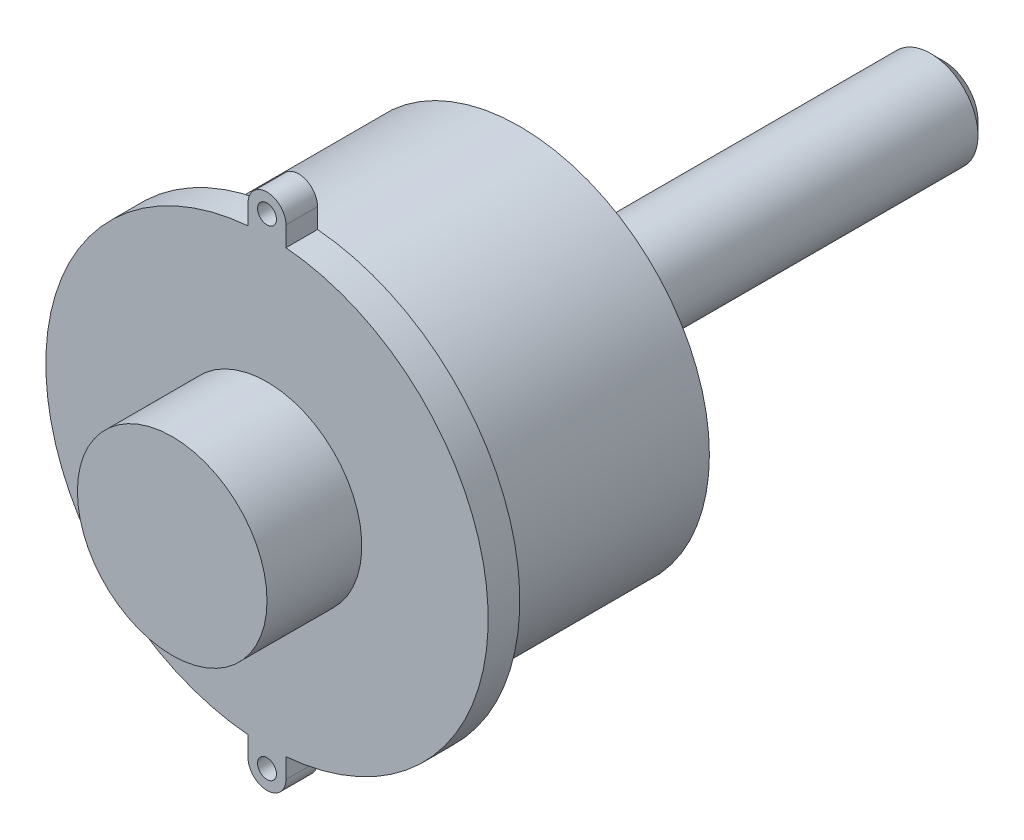
ISO-10303-21;
HEADER;
FILE_DESCRIPTION(('STEP AP214'),'2;1');
FILE_NAME('part.step','',(''),(''),'','','');
FILE_SCHEMA(('AUTOMOTIVE_DESIGN { 1 0 10303 214 1 1 1 1 }'));
ENDSEC;
DATA;
#1=APPLICATION_CONTEXT('core data for automotive mechanical design processes');
#2=APPLICATION_PROTOCOL_DEFINITION('international standard','automotive_design',2000,#1);
#3=PRODUCT_CONTEXT('',#1,'mechanical');
#4=PRODUCT('Part','Part','',(#3));
#5=PRODUCT_RELATED_PRODUCT_CATEGORY('part','',(#4));
#6=PRODUCT_DEFINITION_FORMATION('','',#4);
#7=PRODUCT_DEFINITION_CONTEXT('part definition',#1,'design');
#8=PRODUCT_DEFINITION('design','',#6,#7);
#9=PRODUCT_DEFINITION_SHAPE('','',#8);
#10=(LENGTH_UNIT() NAMED_UNIT(*) SI_UNIT(.MILLI.,.METRE.));
#11=(NAMED_UNIT(*) PLANE_ANGLE_UNIT() SI_UNIT($,.RADIAN.));
#12=(NAMED_UNIT(*) SI_UNIT($,.STERADIAN.) SOLID_ANGLE_UNIT());
#13=UNCERTAINTY_MEASURE_WITH_UNIT(LENGTH_MEASURE(1.E-05),#10,'distance_accuracy_value','');
#14=(GEOMETRIC_REPRESENTATION_CONTEXT(3) GLOBAL_UNCERTAINTY_ASSIGNED_CONTEXT((#13)) GLOBAL_UNIT_ASSIGNED_CONTEXT((#10,
#11,#12)) REPRESENTATION_CONTEXT('',''));
#15=CARTESIAN_POINT('',(0.,0.,0.));
#16=DIRECTION('',(0.,0.,1.));
#17=DIRECTION('',(1.,0.,0.));
#18=AXIS2_PLACEMENT_3D('',#15,#16,#17);
#19=CARTESIAN_POINT('',(0.,0.,-40.));
#20=DIRECTION('',(0.,0.,-1.));
#21=DIRECTION('',(-1.,0.,0.));
#22=AXIS2_PLACEMENT_3D('',#19,#20,#21);
#23=PLANE('',#22);
#24=CARTESIAN_POINT('',(0.,0.,-40.));
#25=DIRECTION('',(0.,0.,-1.));
#26=DIRECTION('',(-1.,0.,0.));
#27=AXIS2_PLACEMENT_3D('',#24,#25,#26);
#28=CIRCLE('',#27,30.);
#29=CARTESIAN_POINT('',(-30.,0.,-40.));
#30=VERTEX_POINT('',#29);
#31=EDGE_CURVE('E229',#30,#30,#28,.T.);
#32=ORIENTED_EDGE('',*,*,#31,.T.);
#33=EDGE_LOOP('',(#32));
#34=FACE_BOUND('',#33,.T.);
#35=CARTESIAN_POINT('',(0.,0.,-40.));
#36=DIRECTION('',(0.,0.,-1.));
#37=DIRECTION('',(-1.,0.,0.));
#38=AXIS2_PLACEMENT_3D('',#35,#36,#37);
#39=CIRCLE('',#38,10.);
#40=CARTESIAN_POINT('',(4.13231581223888,9.10625971669601,-40.));
#41=VERTEX_POINT('',#40);
#42=EDGE_CURVE('E220',#41,#41,#39,.T.);
#43=ORIENTED_EDGE('',*,*,#42,.F.);
#44=EDGE_LOOP('',(#43));
#45=FACE_BOUND('',#44,.T.);
#46=ADVANCED_FACE('F42',(#34,#45),#23,.T.);
#47=CARTESIAN_POINT('',(0.,38.,-5.));
#48=DIRECTION('',(0.,0.,1.));
#49=DIRECTION('',(1.,0.,0.));
#50=AXIS2_PLACEMENT_3D('',#47,#48,#49);
#51=CYLINDRICAL_SURFACE('',#50,3.00000000000001);
#52=CARTESIAN_POINT('',(0.,38.,0.));
#53=DIRECTION('',(0.,0.,1.));
#54=DIRECTION('',(-1.,0.,0.));
#55=AXIS2_PLACEMENT_3D('',#52,#53,#54);
#56=CIRCLE('',#55,3.00000000000001);
#57=CARTESIAN_POINT('',(3.00000000000002,38.,0.));
#58=VERTEX_POINT('',#57);
#59=CARTESIAN_POINT('',(-3.,38.,0.));
#60=VERTEX_POINT('',#59);
#61=EDGE_CURVE('E143',#58,#60,#56,.T.);
#62=ORIENTED_EDGE('',*,*,#61,.F.);
#63=DIRECTION('',(0.,0.,1.));
#64=VECTOR('',#63,1.);
#65=CARTESIAN_POINT('',(3.00000000000002,38.,-5.));
#66=LINE('',#65,#64);
#67=CARTESIAN_POINT('',(3.00000000000002,38.,-5.));
#68=VERTEX_POINT('',#67);
#69=EDGE_CURVE('E60',#68,#58,#66,.T.);
#70=ORIENTED_EDGE('',*,*,#69,.F.);
#71=CARTESIAN_POINT('',(0.,38.,-5.));
#72=DIRECTION('',(0.,0.,1.));
#73=DIRECTION('',(-1.,0.,0.));
#74=AXIS2_PLACEMENT_3D('',#71,#72,#73);
#75=CIRCLE('',#74,3.00000000000001);
#76=CARTESIAN_POINT('',(-3.,38.,-5.));
#77=VERTEX_POINT('',#76);
#78=EDGE_CURVE('E165',#68,#77,#75,.T.);
#79=ORIENTED_EDGE('',*,*,#78,.T.);
#80=DIRECTION('',(0.,0.,1.));
#81=VECTOR('',#80,1.);
#82=CARTESIAN_POINT('',(-3.,38.,-5.));
#83=LINE('',#82,#81);
#84=EDGE_CURVE('E101',#77,#60,#83,.T.);
#85=ORIENTED_EDGE('',*,*,#84,.T.);
#86=EDGE_LOOP('',(#62,#70,#79,#85));
#87=FACE_BOUND('',#86,.T.);
#88=ADVANCED_FACE('F265',(#87),#51,.T.);
#89=CARTESIAN_POINT('',(3.00000000000002,38.,-5.));
#90=DIRECTION('',(1.,0.,0.));
#91=DIRECTION('',(0.,1.,0.));
#92=AXIS2_PLACEMENT_3D('',#89,#90,#91);
#93=PLANE('',#92);
#94=DIRECTION('',(0.,1.,0.));
#95=VECTOR('',#94,1.);
#96=CARTESIAN_POINT('',(3.00000000000002,38.,0.));
#97=LINE('',#96,#95);
#98=CARTESIAN_POINT('',(3.00000000000003,34.8711915483254,0.));
#99=VERTEX_POINT('',#98);
#100=EDGE_CURVE('E162',#99,#58,#97,.T.);
#101=ORIENTED_EDGE('',*,*,#100,.F.);
#102=DIRECTION('',(0.,0.,1.));
#103=VECTOR('',#102,1.);
#104=CARTESIAN_POINT('',(3.00000000000003,34.8711915483254,-5.));
#105=LINE('',#104,#103);
#106=CARTESIAN_POINT('',(3.00000000000003,34.8711915483254,-5.));
#107=VERTEX_POINT('',#106);
#108=EDGE_CURVE('E89',#107,#99,#105,.T.);
#109=ORIENTED_EDGE('',*,*,#108,.F.);
#110=DIRECTION('',(0.,1.,0.));
#111=VECTOR('',#110,1.);
#112=CARTESIAN_POINT('',(3.00000000000002,38.,-5.));
#113=LINE('',#112,#111);
#114=EDGE_CURVE('E133',#107,#68,#113,.T.);
#115=ORIENTED_EDGE('',*,*,#114,.T.);
#116=ORIENTED_EDGE('',*,*,#69,.T.);
#117=EDGE_LOOP('',(#101,#109,#115,#116));
#118=FACE_BOUND('',#117,.T.);
#119=ADVANCED_FACE('F268',(#118),#93,.T.);
#120=CARTESIAN_POINT('',(0.,0.,-5.));
#121=DIRECTION('',(0.,0.,1.));
#122=DIRECTION('',(1.,0.,0.));
#123=AXIS2_PLACEMENT_3D('',#120,#121,#122);
#124=CYLINDRICAL_SURFACE('',#123,35.);
#125=CARTESIAN_POINT('',(0.,0.,0.));
#126=DIRECTION('',(0.,0.,1.));
#127=DIRECTION('',(1.,0.,0.));
#128=AXIS2_PLACEMENT_3D('',#125,#126,#127);
#129=CIRCLE('',#128,35.);
#130=CARTESIAN_POINT('',(3.00000000000002,-34.8711915483254,0.));
#131=VERTEX_POINT('',#130);
#132=EDGE_CURVE('E120',#131,#99,#129,.T.);
#133=ORIENTED_EDGE('',*,*,#132,.F.);
#134=DIRECTION('',(0.,0.,1.));
#135=VECTOR('',#134,1.);
#136=CARTESIAN_POINT('',(3.00000000000002,-34.8711915483254,-5.));
#137=LINE('',#136,#135);
#138=CARTESIAN_POINT('',(3.00000000000002,-34.8711915483254,-5.));
#139=VERTEX_POINT('',#138);
#140=EDGE_CURVE('E115',#139,#131,#137,.T.);
#141=ORIENTED_EDGE('',*,*,#140,.F.);
#142=CARTESIAN_POINT('',(0.,0.,-5.));
#143=DIRECTION('',(0.,0.,1.));
#144=DIRECTION('',(1.,0.,0.));
#145=AXIS2_PLACEMENT_3D('',#142,#143,#144);
#146=CIRCLE('',#145,35.);
#147=EDGE_CURVE('E118',#139,#107,#146,.T.);
#148=ORIENTED_EDGE('',*,*,#147,.T.);
#149=ORIENTED_EDGE('',*,*,#108,.T.);
#150=EDGE_LOOP('',(#133,#141,#148,#149));
#151=FACE_BOUND('',#150,.T.);
#152=ADVANCED_FACE('F117',(#151),#124,.T.);
#153=CARTESIAN_POINT('',(3.00000000000002,-38.,-5.));
#154=DIRECTION('',(1.,0.,0.));
#155=DIRECTION('',(0.,1.,0.));
#156=AXIS2_PLACEMENT_3D('',#153,#154,#155);
#157=PLANE('',#156);
#158=DIRECTION('',(0.,1.,0.));
#159=VECTOR('',#158,1.);
#160=CARTESIAN_POINT('',(3.00000000000002,-38.,0.));
#161=LINE('',#160,#159);
#162=CARTESIAN_POINT('',(3.00000000000002,-38.,0.));
#163=VERTEX_POINT('',#162);
#164=EDGE_CURVE('E159',#163,#131,#161,.T.);
#165=ORIENTED_EDGE('',*,*,#164,.F.);
#166=DIRECTION('',(0.,0.,1.));
#167=VECTOR('',#166,1.);
#168=CARTESIAN_POINT('',(3.00000000000002,-38.,-5.));
#169=LINE('',#168,#167);
#170=CARTESIAN_POINT('',(3.00000000000002,-38.,-5.));
#171=VERTEX_POINT('',#170);
#172=EDGE_CURVE('E125',#171,#163,#169,.T.);
#173=ORIENTED_EDGE('',*,*,#172,.F.);
#174=DIRECTION('',(0.,1.,0.));
#175=VECTOR('',#174,1.);
#176=CARTESIAN_POINT('',(3.00000000000002,-38.,-5.));
#177=LINE('',#176,#175);
#178=EDGE_CURVE('E131',#171,#139,#177,.T.);
#179=ORIENTED_EDGE('',*,*,#178,.T.);
#180=ORIENTED_EDGE('',*,*,#140,.T.);
#181=EDGE_LOOP('',(#165,#173,#179,#180));
#182=FACE_BOUND('',#181,.T.);
#183=ADVANCED_FACE('F135',(#182),#157,.T.);
#184=CARTESIAN_POINT('',(0.,-38.,-5.));
#185=DIRECTION('',(0.,0.,1.));
#186=DIRECTION('',(1.,0.,0.));
#187=AXIS2_PLACEMENT_3D('',#184,#185,#186);
#188=CYLINDRICAL_SURFACE('',#187,3.00000000000001);
#189=CARTESIAN_POINT('',(0.,-38.,0.));
#190=DIRECTION('',(0.,0.,1.));
#191=DIRECTION('',(1.,0.,0.));
#192=AXIS2_PLACEMENT_3D('',#189,#190,#191);
#193=CIRCLE('',#192,3.00000000000001);
#194=CARTESIAN_POINT('',(-3.,-38.,0.));
#195=VERTEX_POINT('',#194);
#196=EDGE_CURVE('E156',#195,#163,#193,.T.);
#197=ORIENTED_EDGE('',*,*,#196,.F.);
#198=DIRECTION('',(0.,0.,1.));
#199=VECTOR('',#198,1.);
#200=CARTESIAN_POINT('',(-3.,-38.,-5.));
#201=LINE('',#200,#199);
#202=CARTESIAN_POINT('',(-3.,-38.,-5.));
#203=VERTEX_POINT('',#202);
#204=EDGE_CURVE('E170',#203,#195,#201,.T.);
#205=ORIENTED_EDGE('',*,*,#204,.F.);
#206=CARTESIAN_POINT('',(0.,-38.,-5.));
#207=DIRECTION('',(0.,0.,1.));
#208=DIRECTION('',(1.,0.,0.));
#209=AXIS2_PLACEMENT_3D('',#206,#207,#208);
#210=CIRCLE('',#209,3.00000000000001);
#211=EDGE_CURVE('E136',#203,#171,#210,.T.);
#212=ORIENTED_EDGE('',*,*,#211,.T.);
#213=ORIENTED_EDGE('',*,*,#172,.T.);
#214=EDGE_LOOP('',(#197,#205,#212,#213));
#215=FACE_BOUND('',#214,.T.);
#216=ADVANCED_FACE('F412',(#215),#188,.T.);
#217=CARTESIAN_POINT('',(-3.,-38.,-5.));
#218=DIRECTION('',(-1.,0.,0.));
#219=DIRECTION('',(0.,0.,1.));
#220=AXIS2_PLACEMENT_3D('',#217,#218,#219);
#221=PLANE('',#220);
#222=DIRECTION('',(0.,-1.,0.));
#223=VECTOR('',#222,1.);
#224=CARTESIAN_POINT('',(-3.,-38.,0.));
#225=LINE('',#224,#223);
#226=CARTESIAN_POINT('',(-3.,-34.8711915483254,0.));
#227=VERTEX_POINT('',#226);
#228=EDGE_CURVE('E153',#227,#195,#225,.T.);
#229=ORIENTED_EDGE('',*,*,#228,.F.);
#230=DIRECTION('',(0.,0.,1.));
#231=VECTOR('',#230,1.);
#232=CARTESIAN_POINT('',(-3.,-34.8711915483254,-5.));
#233=LINE('',#232,#231);
#234=CARTESIAN_POINT('',(-3.,-34.8711915483254,-5.));
#235=VERTEX_POINT('',#234);
#236=EDGE_CURVE('E172',#235,#227,#233,.T.);
#237=ORIENTED_EDGE('',*,*,#236,.F.);
#238=DIRECTION('',(0.,-1.,0.));
#239=VECTOR('',#238,1.);
#240=CARTESIAN_POINT('',(-3.,-38.,-5.));
#241=LINE('',#240,#239);
#242=EDGE_CURVE('E138',#235,#203,#241,.T.);
#243=ORIENTED_EDGE('',*,*,#242,.T.);
#244=ORIENTED_EDGE('',*,*,#204,.T.);
#245=EDGE_LOOP('',(#229,#237,#243,#244));
#246=FACE_BOUND('',#245,.T.);
#247=ADVANCED_FACE('F258',(#246),#221,.T.);
#248=CARTESIAN_POINT('',(0.,0.,-5.));
#249=DIRECTION('',(0.,0.,1.));
#250=DIRECTION('',(1.,0.,0.));
#251=AXIS2_PLACEMENT_3D('',#248,#249,#250);
#252=CYLINDRICAL_SURFACE('',#251,35.);
#253=CARTESIAN_POINT('',(0.,0.,0.));
#254=DIRECTION('',(0.,0.,1.));
#255=DIRECTION('',(1.,0.,0.));
#256=AXIS2_PLACEMENT_3D('',#253,#254,#255);
#257=CIRCLE('',#256,35.);
#258=CARTESIAN_POINT('',(-3.,34.8711915483254,0.));
#259=VERTEX_POINT('',#258);
#260=EDGE_CURVE('E150',#259,#227,#257,.T.);
#261=ORIENTED_EDGE('',*,*,#260,.F.);
#262=DIRECTION('',(0.,0.,1.));
#263=VECTOR('',#262,1.);
#264=CARTESIAN_POINT('',(-3.,34.8711915483254,-5.));
#265=LINE('',#264,#263);
#266=CARTESIAN_POINT('',(-3.,34.8711915483254,-5.));
#267=VERTEX_POINT('',#266);
#268=EDGE_CURVE('E174',#267,#259,#265,.T.);
#269=ORIENTED_EDGE('',*,*,#268,.F.);
#270=CARTESIAN_POINT('',(0.,0.,-5.));
#271=DIRECTION('',(0.,0.,1.));
#272=DIRECTION('',(1.,0.,0.));
#273=AXIS2_PLACEMENT_3D('',#270,#271,#272);
#274=CIRCLE('',#273,35.);
#275=EDGE_CURVE('E252',#267,#235,#274,.T.);
#276=ORIENTED_EDGE('',*,*,#275,.T.);
#277=ORIENTED_EDGE('',*,*,#236,.T.);
#278=EDGE_LOOP('',(#261,#269,#276,#277));
#279=FACE_BOUND('',#278,.T.);
#280=ADVANCED_FACE('F263',(#279),#252,.T.);
#281=CARTESIAN_POINT('',(-3.,38.,-5.));
#282=DIRECTION('',(-1.,0.,0.));
#283=DIRECTION('',(0.,0.,1.));
#284=AXIS2_PLACEMENT_3D('',#281,#282,#283);
#285=PLANE('',#284);
#286=DIRECTION('',(0.,-1.,0.));
#287=VECTOR('',#286,1.);
#288=CARTESIAN_POINT('',(-3.,38.,0.));
#289=LINE('',#288,#287);
#290=EDGE_CURVE('E146',#60,#259,#289,.T.);
#291=ORIENTED_EDGE('',*,*,#290,.F.);
#292=ORIENTED_EDGE('',*,*,#84,.F.);
#293=DIRECTION('',(0.,-1.,0.));
#294=VECTOR('',#293,1.);
#295=CARTESIAN_POINT('',(-3.,38.,-5.));
#296=LINE('',#295,#294);
#297=EDGE_CURVE('E250',#77,#267,#296,.T.);
#298=ORIENTED_EDGE('',*,*,#297,.T.);
#299=ORIENTED_EDGE('',*,*,#268,.T.);
#300=EDGE_LOOP('',(#291,#292,#298,#299));
#301=FACE_BOUND('',#300,.T.);
#302=ADVANCED_FACE('F264',(#301),#285,.T.);
#303=CARTESIAN_POINT('',(0.,38.,-5.));
#304=DIRECTION('',(0.,0.,-1.));
#305=DIRECTION('',(-1.,0.,0.));
#306=AXIS2_PLACEMENT_3D('',#303,#304,#305);
#307=PLANE('',#306);
#308=CARTESIAN_POINT('',(0.,0.,-5.));
#309=DIRECTION('',(0.,0.,-1.));
#310=DIRECTION('',(-1.,0.,0.));
#311=AXIS2_PLACEMENT_3D('',#308,#309,#310);
#312=CIRCLE('',#311,30.);
#313=CARTESIAN_POINT('',(-30.,0.,-5.));
#314=VERTEX_POINT('',#313);
#315=EDGE_CURVE('E233',#314,#314,#312,.T.);
#316=ORIENTED_EDGE('',*,*,#315,.F.);
#317=EDGE_LOOP('',(#316));
#318=FACE_BOUND('',#317,.T.);
#319=CARTESIAN_POINT('',(0.,-38.,-5.));
#320=DIRECTION('',(0.,0.,1.));
#321=DIRECTION('',(-1.,0.,0.));
#322=AXIS2_PLACEMENT_3D('',#319,#320,#321);
#323=CIRCLE('',#322,1.5);
#324=CARTESIAN_POINT('',(-1.49999999999999,-38.,-5.));
#325=VERTEX_POINT('',#324);
#326=EDGE_CURVE('E239',#325,#325,#323,.T.);
#327=ORIENTED_EDGE('',*,*,#326,.T.);
#328=EDGE_LOOP('',(#327));
#329=FACE_BOUND('',#328,.T.);
#330=CARTESIAN_POINT('',(0.,38.,-5.));
#331=DIRECTION('',(0.,0.,1.));
#332=DIRECTION('',(1.,0.,0.));
#333=AXIS2_PLACEMENT_3D('',#330,#331,#332);
#334=CIRCLE('',#333,1.5);
#335=CARTESIAN_POINT('',(1.50000000000001,38.,-5.));
#336=VERTEX_POINT('',#335);
#337=EDGE_CURVE('E147',#336,#336,#334,.T.);
#338=ORIENTED_EDGE('',*,*,#337,.T.);
#339=EDGE_LOOP('',(#338));
#340=FACE_BOUND('',#339,.T.);
#341=ORIENTED_EDGE('',*,*,#78,.F.);
#342=ORIENTED_EDGE('',*,*,#114,.F.);
#343=ORIENTED_EDGE('',*,*,#147,.F.);
#344=ORIENTED_EDGE('',*,*,#178,.F.);
#345=ORIENTED_EDGE('',*,*,#211,.F.);
#346=ORIENTED_EDGE('',*,*,#242,.F.);
#347=ORIENTED_EDGE('',*,*,#275,.F.);
#348=ORIENTED_EDGE('',*,*,#297,.F.);
#349=EDGE_LOOP('',(#341,#342,#343,#344,#345,#346,#347,#348));
#350=FACE_BOUND('',#349,.T.);
#351=ADVANCED_FACE('F129',(#318,#329,#340,#350),#307,.T.);
#352=CARTESIAN_POINT('',(0.,38.,0.));
#353=DIRECTION('',(0.,0.,-1.));
#354=DIRECTION('',(-1.,0.,0.));
#355=AXIS2_PLACEMENT_3D('',#352,#353,#354);
#356=PLANE('',#355);
#357=CARTESIAN_POINT('',(0.,0.,0.));
#358=DIRECTION('',(0.,0.,-1.));
#359=DIRECTION('',(-1.,0.,0.));
#360=AXIS2_PLACEMENT_3D('',#357,#358,#359);
#361=CIRCLE('',#360,15.);
#362=CARTESIAN_POINT('',(-15.,0.,0.));
#363=VERTEX_POINT('',#362);
#364=EDGE_CURVE('E167',#363,#363,#361,.F.);
#365=ORIENTED_EDGE('',*,*,#364,.F.);
#366=EDGE_LOOP('',(#365));
#367=FACE_BOUND('',#366,.T.);
#368=CARTESIAN_POINT('',(0.,-38.,0.));
#369=DIRECTION('',(0.,0.,1.));
#370=DIRECTION('',(-1.,0.,0.));
#371=AXIS2_PLACEMENT_3D('',#368,#369,#370);
#372=CIRCLE('',#371,1.5);
#373=CARTESIAN_POINT('',(-1.49999999999999,-38.,0.));
#374=VERTEX_POINT('',#373);
#375=EDGE_CURVE('E238',#374,#374,#372,.T.);
#376=ORIENTED_EDGE('',*,*,#375,.F.);
#377=EDGE_LOOP('',(#376));
#378=FACE_BOUND('',#377,.T.);
#379=CARTESIAN_POINT('',(0.,38.,0.));
#380=DIRECTION('',(0.,0.,1.));
#381=DIRECTION('',(1.,0.,0.));
#382=AXIS2_PLACEMENT_3D('',#379,#380,#381);
#383=CIRCLE('',#382,1.5);
#384=CARTESIAN_POINT('',(1.50000000000001,38.,0.));
#385=VERTEX_POINT('',#384);
#386=EDGE_CURVE('E242',#385,#385,#383,.T.);
#387=ORIENTED_EDGE('',*,*,#386,.F.);
#388=EDGE_LOOP('',(#387));
#389=FACE_BOUND('',#388,.T.);
#390=ORIENTED_EDGE('',*,*,#61,.T.);
#391=ORIENTED_EDGE('',*,*,#290,.T.);
#392=ORIENTED_EDGE('',*,*,#260,.T.);
#393=ORIENTED_EDGE('',*,*,#228,.T.);
#394=ORIENTED_EDGE('',*,*,#196,.T.);
#395=ORIENTED_EDGE('',*,*,#164,.T.);
#396=ORIENTED_EDGE('',*,*,#132,.T.);
#397=ORIENTED_EDGE('',*,*,#100,.T.);
#398=EDGE_LOOP('',(#390,#391,#392,#393,#394,#395,#396,#397));
#399=FACE_BOUND('',#398,.T.);
#400=ADVANCED_FACE('F267',(#367,#378,#389,#399),#356,.F.);
#401=CARTESIAN_POINT('',(0.,38.,-5.));
#402=DIRECTION('',(0.,0.,1.));
#403=DIRECTION('',(1.,0.,0.));
#404=AXIS2_PLACEMENT_3D('',#401,#402,#403);
#405=CYLINDRICAL_SURFACE('',#404,1.5);
#406=ORIENTED_EDGE('',*,*,#337,.F.);
#407=EDGE_LOOP('',(#406));
#408=FACE_BOUND('',#407,.T.);
#409=ORIENTED_EDGE('',*,*,#386,.T.);
#410=EDGE_LOOP('',(#409));
#411=FACE_BOUND('',#410,.T.);
#412=ADVANCED_FACE('F298',(#408,#411),#405,.F.);
#413=CARTESIAN_POINT('',(0.,-38.,-5.));
#414=DIRECTION('',(0.,0.,1.));
#415=DIRECTION('',(1.,0.,0.));
#416=AXIS2_PLACEMENT_3D('',#413,#414,#415);
#417=CYLINDRICAL_SURFACE('',#416,1.5);
#418=ORIENTED_EDGE('',*,*,#326,.F.);
#419=EDGE_LOOP('',(#418));
#420=FACE_BOUND('',#419,.T.);
#421=ORIENTED_EDGE('',*,*,#375,.T.);
#422=EDGE_LOOP('',(#421));
#423=FACE_BOUND('',#422,.T.);
#424=ADVANCED_FACE('F301',(#420,#423),#417,.F.);
#425=CARTESIAN_POINT('',(0.,0.,15.));
#426=DIRECTION('',(0.,0.,-1.));
#427=DIRECTION('',(-1.,0.,0.));
#428=AXIS2_PLACEMENT_3D('',#425,#426,#427);
#429=CYLINDRICAL_SURFACE('',#428,15.);
#430=CARTESIAN_POINT('',(0.,0.,15.));
#431=DIRECTION('',(0.,0.,1.));
#432=DIRECTION('',(1.,0.,0.));
#433=AXIS2_PLACEMENT_3D('',#430,#431,#432);
#434=CIRCLE('',#433,15.);
#435=CARTESIAN_POINT('',(15.,0.,15.));
#436=VERTEX_POINT('',#435);
#437=EDGE_CURVE('E232',#436,#436,#434,.T.);
#438=ORIENTED_EDGE('',*,*,#437,.F.);
#439=EDGE_LOOP('',(#438));
#440=FACE_BOUND('',#439,.T.);
#441=ORIENTED_EDGE('',*,*,#364,.T.);
#442=EDGE_LOOP('',(#441));
#443=FACE_BOUND('',#442,.T.);
#444=ADVANCED_FACE('F314',(#440,#443),#429,.T.);
#445=CARTESIAN_POINT('',(0.,0.,15.));
#446=DIRECTION('',(0.,0.,1.));
#447=DIRECTION('',(1.,0.,0.));
#448=AXIS2_PLACEMENT_3D('',#445,#446,#447);
#449=PLANE('',#448);
#450=ORIENTED_EDGE('',*,*,#437,.T.);
#451=EDGE_LOOP('',(#450));
#452=FACE_BOUND('',#451,.T.);
#453=ADVANCED_FACE('F288',(#452),#449,.T.);
#454=CARTESIAN_POINT('',(0.,0.,-40.));
#455=DIRECTION('',(0.,0.,1.));
#456=DIRECTION('',(1.,0.,0.));
#457=AXIS2_PLACEMENT_3D('',#454,#455,#456);
#458=CYLINDRICAL_SURFACE('',#457,30.);
#459=ORIENTED_EDGE('',*,*,#31,.F.);
#460=EDGE_LOOP('',(#459));
#461=FACE_BOUND('',#460,.T.);
#462=ORIENTED_EDGE('',*,*,#315,.T.);
#463=EDGE_LOOP('',(#462));
#464=FACE_BOUND('',#463,.T.);
#465=ADVANCED_FACE('F207',(#461,#464),#458,.T.);
#466=CARTESIAN_POINT('',(4.13231581223888,9.10625971669601,-40.));
#467=CARTESIAN_POINT('',(5.32989104731823,5.27657667656947,-47.));
#468=CARTESIAN_POINT('',(22.3448352456309,0.841628092218247,-40.));
#469=CARTESIAN_POINT('',(15.8830444004572,-5.38320541806699,-47.));
#470=CARTESIAN_POINT('',(14.0802036211531,-17.3708913411738,-40.));
#471=CARTESIAN_POINT('',(5.22326230582071,-15.9363587712059,-47.));
#472=CARTESIAN_POINT('',(-4.13231581223888,-9.10625971669601,-40.));
#473=CARTESIAN_POINT('',(-5.32989104731823,-5.27657667656947,-47.));
#474=CARTESIAN_POINT('',(-22.3448352456309,-0.841628092218254,-40.));
#475=CARTESIAN_POINT('',(-15.8830444004572,5.38320541806699,-47.));
#476=CARTESIAN_POINT('',(-14.0802036211531,17.3708913411738,-40.));
#477=CARTESIAN_POINT('',(-5.22326230582071,15.9363587712059,-47.));
#478=CARTESIAN_POINT('',(4.13231581223888,9.10625971669601,-40.));
#479=CARTESIAN_POINT('',(5.32989104731823,5.27657667656947,-47.));
#480=(BOUNDED_SURFACE() B_SPLINE_SURFACE(3,1,((#466,#467),(#468,#469),(#470,#471),(#472,#473),
(#474,#475),(#476,#477),(#478,#479)),.UNSPECIFIED.,.T.,.F.,.F.) B_SPLINE_SURFACE_WITH_KNOTS((4,
3,4),(2,2),(0.,0.5,1.),(0.,1.),
.UNSPECIFIED.) GEOMETRIC_REPRESENTATION_ITEM() RATIONAL_B_SPLINE_SURFACE(((1.,1.),
(0.333333333333334,0.333333333333333),(0.333333333333334,0.333333333333333),(1.,1.),
(0.333333333333333,0.333333333333333),(0.333333333333333,0.333333333333333),(1.,1.))) REPRESENTATION_ITEM('') SURFACE());
#481=CARTESIAN_POINT('',(0.,0.,-47.));
#482=DIRECTION('',(0.,0.,-1.));
#483=DIRECTION('',(-1.,0.,0.));
#484=AXIS2_PLACEMENT_3D('',#481,#482,#483);
#485=CIRCLE('',#484,7.5);
#486=CARTESIAN_POINT('',(5.32989104731823,5.27657667656947,-47.));
#487=VERTEX_POINT('',#486);
#488=EDGE_CURVE('E183',#487,#487,#485,.T.);
#489=CARTESIAN_POINT('',(4.13231581223888,9.10625971669601,-40.));
#490=CARTESIAN_POINT('',(4.14479055427096,9.06636718502803,-40.0729166666667));
#491=CARTESIAN_POINT('',(4.15726529630304,9.02647465336004,-40.1458333333333));
#492=CARTESIAN_POINT('',(4.18221478036719,8.94668959002407,-40.2916666666667));
#493=CARTESIAN_POINT('',(4.19468952239927,8.90679705835609,-40.3645833333333));
#494=CARTESIAN_POINT('',(4.21963900646342,8.82701199502012,-40.5104166666667));
#495=CARTESIAN_POINT('',(4.2321137484955,8.78711946335213,-40.5833333333333));
#496=CARTESIAN_POINT('',(4.25706323255965,8.70733440001616,-40.7291666666667));
#497=CARTESIAN_POINT('',(4.26953797459173,8.66744186834818,-40.8020833333333));
#498=CARTESIAN_POINT('',(4.29448745865588,8.58765680501221,-40.9479166666667));
#499=CARTESIAN_POINT('',(4.30696220068795,8.54776427334422,-41.0208333333333));
#500=CARTESIAN_POINT('',(4.33191168475211,8.46797921000825,-41.1666666666667));
#501=CARTESIAN_POINT('',(4.34438642678418,8.42808667834027,-41.2395833333333));
#502=CARTESIAN_POINT('',(4.36933591084834,8.3483016150043,-41.3854166666667));
#503=CARTESIAN_POINT('',(4.38181065288041,8.30840908333632,-41.4583333333333));
#504=CARTESIAN_POINT('',(4.40676013694457,8.22862402000035,-41.6041666666667));
#505=CARTESIAN_POINT('',(4.41923487897664,8.18873148833236,-41.6770833333333));
#506=CARTESIAN_POINT('',(4.4441843630408,8.10894642499639,-41.8229166666667));
#507=CARTESIAN_POINT('',(4.45665910507287,8.06905389332841,-41.8958333333333));
#508=CARTESIAN_POINT('',(4.48160858913703,7.98926882999244,-42.0416666666667));
#509=CARTESIAN_POINT('',(4.4940833311691,7.94937629832445,-42.1145833333333));
#510=CARTESIAN_POINT('',(4.51903281523326,7.86959123498848,-42.2604166666667));
#511=CARTESIAN_POINT('',(4.53150755726533,7.8296987033205,-42.3333333333333));
#512=CARTESIAN_POINT('',(4.55645704132949,7.74991363998453,-42.4791666666667));
#513=CARTESIAN_POINT('',(4.56893178336156,7.71002110831654,-42.5520833333333));
#514=CARTESIAN_POINT('',(4.59388126742572,7.63023604498057,-42.6979166666667));
#515=CARTESIAN_POINT('',(4.60635600945779,7.59034351331259,-42.7708333333333));
#516=CARTESIAN_POINT('',(4.63130549352195,7.51055844997662,-42.9166666666667));
#517=CARTESIAN_POINT('',(4.64378023555402,7.47066591830864,-42.9895833333333));
#518=CARTESIAN_POINT('',(4.66872971961818,7.39088085497267,-43.1354166666667));
#519=CARTESIAN_POINT('',(4.68120446165025,7.35098832330468,-43.2083333333333));
#520=CARTESIAN_POINT('',(4.70615394571441,7.27120325996871,-43.3541666666667));
#521=CARTESIAN_POINT('',(4.71862868774648,7.23131072830073,-43.4270833333333));
#522=CARTESIAN_POINT('',(4.74357817181064,7.15152566496476,-43.5729166666667));
#523=CARTESIAN_POINT('',(4.75605291384271,7.11163313329677,-43.6458333333333));
#524=CARTESIAN_POINT('',(4.78100239790686,7.0318480699608,-43.7916666666667));
#525=CARTESIAN_POINT('',(4.79347713993894,6.99195553829282,-43.8645833333333));
#526=CARTESIAN_POINT('',(4.8184266240031,6.91217047495685,-44.0104166666667));
#527=CARTESIAN_POINT('',(4.83090136603517,6.87227794328886,-44.0833333333333));
#528=CARTESIAN_POINT('',(4.85585085009932,6.79249287995289,-44.2291666666667));
#529=CARTESIAN_POINT('',(4.8683255921314,6.75260034828491,-44.3020833333333));
#530=CARTESIAN_POINT('',(4.89327507619555,6.67281528494894,-44.4479166666667));
#531=CARTESIAN_POINT('',(4.90574981822763,6.63292275328095,-44.5208333333333));
#532=CARTESIAN_POINT('',(4.93069930229178,6.55313768994499,-44.6666666666667));
#533=CARTESIAN_POINT('',(4.94317404432386,6.513245158277,-44.7395833333333));
#534=CARTESIAN_POINT('',(4.96812352838801,6.43346009494103,-44.8854166666667));
#535=CARTESIAN_POINT('',(4.98059827042009,6.39356756327305,-44.9583333333333));
#536=CARTESIAN_POINT('',(5.00554775448424,6.31378249993708,-45.1041666666667));
#537=CARTESIAN_POINT('',(5.01802249651632,6.27388996826909,-45.1770833333333));
#538=CARTESIAN_POINT('',(5.04297198058047,6.19410490493312,-45.3229166666667));
#539=CARTESIAN_POINT('',(5.05544672261255,6.15421237326514,-45.3958333333333));
#540=CARTESIAN_POINT('',(5.0803962066767,6.07442730992917,-45.5416666666667));
#541=CARTESIAN_POINT('',(5.09287094870878,6.03453477826118,-45.6145833333333));
#542=CARTESIAN_POINT('',(5.11782043277293,5.95474971492521,-45.7604166666667));
#543=CARTESIAN_POINT('',(5.13029517480501,5.91485718325723,-45.8333333333333));
#544=CARTESIAN_POINT('',(5.15524465886916,5.83507211992126,-45.9791666666667));
#545=CARTESIAN_POINT('',(5.16771940090124,5.79517958825327,-46.0520833333333));
#546=CARTESIAN_POINT('',(5.19266888496539,5.71539452491731,-46.1979166666667));
#547=CARTESIAN_POINT('',(5.20514362699747,5.67550199324932,-46.2708333333333));
#548=CARTESIAN_POINT('',(5.23009311106162,5.59571692991335,-46.4166666666667));
#549=CARTESIAN_POINT('',(5.2425678530937,5.55582439824537,-46.4895833333333));
#550=CARTESIAN_POINT('',(5.26751733715785,5.4760393349094,-46.6354166666667));
#551=CARTESIAN_POINT('',(5.27999207918993,5.43614680324141,-46.7083333333333));
#552=CARTESIAN_POINT('',(5.30494156325408,5.35636173990544,-46.8541666666667));
#553=CARTESIAN_POINT('',(5.31741630528616,5.31646920823746,-46.9270833333333));
#554=CARTESIAN_POINT('',(5.32989104731823,5.27657667656947,-47.));
#555=B_SPLINE_CURVE_WITH_KNOTS('',3,(#489,#490,#491,#492,#493,#494,#495,#496,#497,#498,#499,
#500,#501,#502,#503,#504,#505,#506,#507,#508,#509,#510,#511,#512,#513,#514,#515,#516,#517,#518,
#519,#520,#521,#522,#523,#524,#525,#526,#527,#528,#529,#530,#531,#532,#533,#534,#535,#536,#537,
#538,#539,#540,#541,#542,#543,#544,#545,#546,#547,#548,#549,#550,#551,#552,#553,#554),
.UNSPECIFIED.,.F.,.F.,(4,2,2,2,2,2,2,2,2,2,2,2,2,2,2,2,2,2,2,2,2,2,2,2,2,2,2,2,2,2,2,2,4),(0.,
0.252140559896321,0.50428111979265,0.756421679688972,1.0085622395853,1.26070279948162,
1.51284335937795,1.76498391927427,2.01712447917059,2.26926503906692,2.52140559896325,
2.77354615885957,3.0256867187559,3.27782727865222,3.52996783854855,3.78210839844487,
4.0342489583412,4.28638951823752,4.53853007813385,4.79067063803017,5.0428111979265,
5.29495175782282,5.54709231771915,5.79923287761547,6.0513734375118,6.30351399740812,
6.55565455730445,6.80779511720077,7.0599356770971,7.31207623699343,7.56421679688975,
7.81635735678608,8.0684979166824),.UNSPECIFIED.);
#556=EDGE_CURVE('BSEAM200',#41,#487,#555,.T.);
#557=ORIENTED_EDGE('',*,*,#42,.T.);
#558=ORIENTED_EDGE('',*,*,#488,.F.);
#559=ORIENTED_EDGE('',*,*,#556,.T.);
#560=ORIENTED_EDGE('',*,*,#556,.F.);
#561=EDGE_LOOP('',(#557,#559,#558,#560));
#562=FACE_BOUND('',#561,.T.);
#563=ADVANCED_FACE('F200',(#562),#480,.T.);
#564=CARTESIAN_POINT('',(0.,0.,-107.));
#565=DIRECTION('',(0.,0.,1.));
#566=DIRECTION('',(1.,0.,0.));
#567=AXIS2_PLACEMENT_3D('',#564,#565,#566);
#568=CYLINDRICAL_SURFACE('',#567,7.5);
#569=CARTESIAN_POINT('',(0.,0.,-105.));
#570=DIRECTION('',(0.,0.,-1.));
#571=DIRECTION('',(-1.,0.,0.));
#572=AXIS2_PLACEMENT_3D('',#569,#570,#571);
#573=CIRCLE('',#572,7.5);
#574=CARTESIAN_POINT('',(-7.5,0.,-105.));
#575=VERTEX_POINT('',#574);
#576=EDGE_CURVE('E12',#575,#575,#573,.F.);
#577=ORIENTED_EDGE('',*,*,#576,.T.);
#578=EDGE_LOOP('',(#577));
#579=FACE_BOUND('',#578,.T.);
#580=ORIENTED_EDGE('',*,*,#488,.T.);
#581=EDGE_LOOP('',(#580));
#582=FACE_BOUND('',#581,.T.);
#583=ADVANCED_FACE('F189',(#579,#582),#568,.T.);
#584=CARTESIAN_POINT('',(0.,0.,-107.));
#585=DIRECTION('',(0.,0.,-1.));
#586=DIRECTION('',(-1.,0.,0.));
#587=AXIS2_PLACEMENT_3D('',#584,#585,#586);
#588=PLANE('',#587);
#589=CARTESIAN_POINT('',(0.,0.,-107.));
#590=DIRECTION('',(0.,0.,-1.));
#591=DIRECTION('',(-1.,0.,0.));
#592=AXIS2_PLACEMENT_3D('',#589,#590,#591);
#593=CIRCLE('',#592,5.50000000000003);
#594=CARTESIAN_POINT('',(-5.50000000000003,0.,-107.));
#595=VERTEX_POINT('',#594);
#596=EDGE_CURVE('E52',#595,#595,#593,.T.);
#597=ORIENTED_EDGE('',*,*,#596,.T.);
#598=EDGE_LOOP('',(#597));
#599=FACE_BOUND('',#598,.T.);
#600=ADVANCED_FACE('F199',(#599),#588,.T.);
#601=CARTESIAN_POINT('',(0.,0.,-107.));
#602=DIRECTION('',(0.,0.,1.));
#603=DIRECTION('',(1.,0.,0.));
#604=AXIS2_PLACEMENT_3D('',#601,#602,#603);
#605=CONICAL_SURFACE('',#604,5.50000000000003,0.785398163397447);
#606=ORIENTED_EDGE('',*,*,#576,.F.);
#607=EDGE_LOOP('',(#606));
#608=FACE_BOUND('',#607,.T.);
#609=ORIENTED_EDGE('',*,*,#596,.F.);
#610=EDGE_LOOP('',(#609));
#611=FACE_BOUND('',#610,.T.);
#612=ADVANCED_FACE('F45',(#608,#611),#605,.T.);
#613=CLOSED_SHELL('',(#46,#88,#119,#152,#183,#216,#247,#280,#302,#351,#400,#412,#424,#444,#453,
#465,#563,#583,#600,#612));
#614=MANIFOLD_SOLID_BREP('B2',#613);
#615=ADVANCED_BREP_SHAPE_REPRESENTATION('',(#18,#614),#14);
#616=SHAPE_DEFINITION_REPRESENTATION(#9,#615);
ENDSEC;
END-ISO-10303-21;
